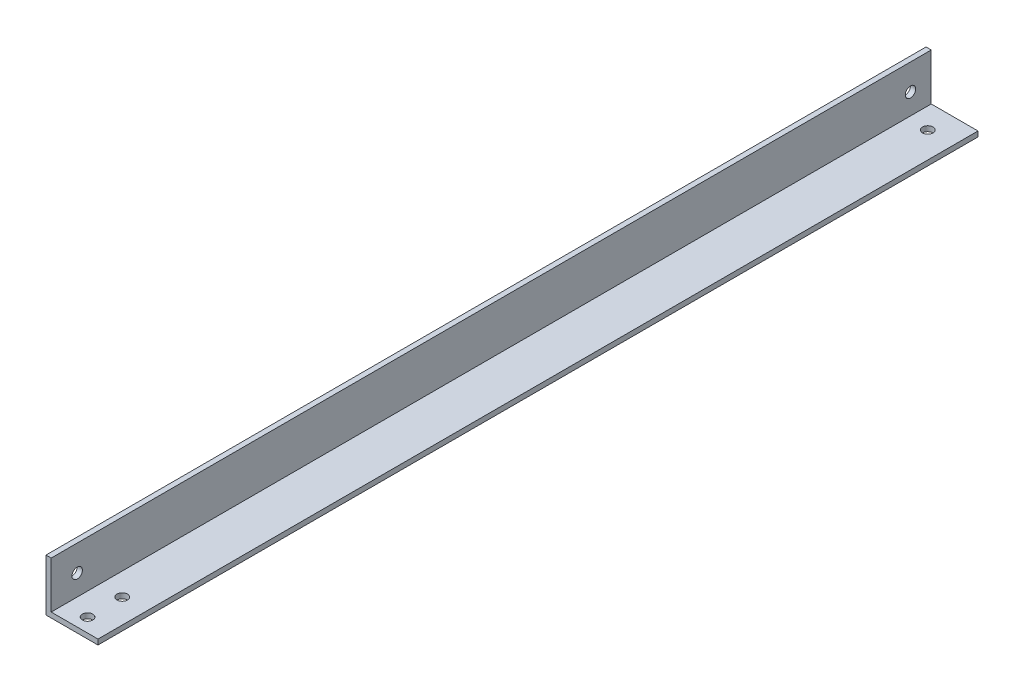
ISO-10303-21;
HEADER;
FILE_DESCRIPTION(('STEP AP214'),'2;1');
FILE_NAME('part.step','',(''),(''),'','','');
FILE_SCHEMA(('AUTOMOTIVE_DESIGN { 1 0 10303 214 1 1 1 1 }'));
ENDSEC;
DATA;
#1=APPLICATION_CONTEXT('core data for automotive mechanical design processes');
#2=APPLICATION_PROTOCOL_DEFINITION('international standard','automotive_design',2000,#1);
#3=PRODUCT_CONTEXT('',#1,'mechanical');
#4=PRODUCT('Part','Part','',(#3));
#5=PRODUCT_RELATED_PRODUCT_CATEGORY('part','',(#4));
#6=PRODUCT_DEFINITION_FORMATION('','',#4);
#7=PRODUCT_DEFINITION_CONTEXT('part definition',#1,'design');
#8=PRODUCT_DEFINITION('design','',#6,#7);
#9=PRODUCT_DEFINITION_SHAPE('','',#8);
#10=(LENGTH_UNIT() NAMED_UNIT(*) SI_UNIT(.MILLI.,.METRE.));
#11=(NAMED_UNIT(*) PLANE_ANGLE_UNIT() SI_UNIT($,.RADIAN.));
#12=(NAMED_UNIT(*) SI_UNIT($,.STERADIAN.) SOLID_ANGLE_UNIT());
#13=UNCERTAINTY_MEASURE_WITH_UNIT(LENGTH_MEASURE(1.E-05),#10,'distance_accuracy_value','');
#14=(GEOMETRIC_REPRESENTATION_CONTEXT(3) GLOBAL_UNCERTAINTY_ASSIGNED_CONTEXT((#13)) GLOBAL_UNIT_ASSIGNED_CONTEXT((#10,
#11,#12)) REPRESENTATION_CONTEXT('',''));
#15=CARTESIAN_POINT('',(0.,0.,0.));
#16=DIRECTION('',(0.,0.,1.));
#17=DIRECTION('',(1.,0.,0.));
#18=AXIS2_PLACEMENT_3D('',#15,#16,#17);
#19=CARTESIAN_POINT('',(-19.7353966243928,-5.62738853503184,254.));
#20=DIRECTION('',(0.,-1.,0.));
#21=DIRECTION('',(0.,0.,-1.));
#22=AXIS2_PLACEMENT_3D('',#19,#20,#21);
#23=PLANE('',#22);
#24=DIRECTION('',(-1.,0.,0.));
#25=VECTOR('',#24,1.);
#26=CARTESIAN_POINT('',(-19.7353966243928,-5.62738853503184,0.));
#27=LINE('',#26,#25);
#28=CARTESIAN_POINT('',(-19.7353966243928,-5.62738853503184,0.));
#29=VERTEX_POINT('',#28);
#30=CARTESIAN_POINT('',(-21.2353966243928,-5.62738853503184,0.));
#31=VERTEX_POINT('',#30);
#32=EDGE_CURVE('E115',#29,#31,#27,.T.);
#33=ORIENTED_EDGE('',*,*,#32,.T.);
#34=DIRECTION('',(0.,0.,-1.));
#35=VECTOR('',#34,1.);
#36=CARTESIAN_POINT('',(-21.2353966243928,-5.62738853503184,254.));
#37=LINE('',#36,#35);
#38=CARTESIAN_POINT('',(-21.2353966243928,-5.62738853503184,254.));
#39=VERTEX_POINT('',#38);
#40=EDGE_CURVE('E11',#39,#31,#37,.T.);
#41=ORIENTED_EDGE('',*,*,#40,.F.);
#42=DIRECTION('',(-1.,0.,0.));
#43=VECTOR('',#42,1.);
#44=CARTESIAN_POINT('',(-19.7353966243928,-5.62738853503184,254.));
#45=LINE('',#44,#43);
#46=CARTESIAN_POINT('',(-19.7353966243928,-5.62738853503184,254.));
#47=VERTEX_POINT('',#46);
#48=EDGE_CURVE('E126',#47,#39,#45,.T.);
#49=ORIENTED_EDGE('',*,*,#48,.F.);
#50=DIRECTION('',(0.,0.,-1.));
#51=VECTOR('',#50,1.);
#52=CARTESIAN_POINT('',(-19.7353966243928,-5.62738853503184,254.));
#53=LINE('',#52,#51);
#54=EDGE_CURVE('E111',#47,#29,#53,.T.);
#55=ORIENTED_EDGE('',*,*,#54,.T.);
#56=EDGE_LOOP('',(#33,#41,#49,#55));
#57=FACE_BOUND('',#56,.T.);
#58=ADVANCED_FACE('F31',(#57),#23,.F.);
#59=CARTESIAN_POINT('',(-21.2353966243928,-5.62738853503184,254.));
#60=DIRECTION('',(1.,0.,0.));
#61=DIRECTION('',(0.,1.,0.));
#62=AXIS2_PLACEMENT_3D('',#59,#60,#61);
#63=PLANE('',#62);
#64=CARTESIAN_POINT('',(-21.2353966243928,-13.1273885350318,246.5));
#65=DIRECTION('',(1.,0.,0.));
#66=DIRECTION('',(0.,1.,0.));
#67=AXIS2_PLACEMENT_3D('',#64,#65,#66);
#68=CIRCLE('',#67,1.5);
#69=CARTESIAN_POINT('',(-21.2353966243929,-13.1273885350318,245.));
#70=VERTEX_POINT('',#69);
#71=EDGE_CURVE('E258',#70,#70,#68,.T.);
#72=ORIENTED_EDGE('',*,*,#71,.T.);
#73=EDGE_LOOP('',(#72));
#74=FACE_BOUND('',#73,.T.);
#75=CARTESIAN_POINT('',(-21.2353966243928,-13.1273885350318,6.));
#76=DIRECTION('',(1.,0.,0.));
#77=DIRECTION('',(0.,1.,0.));
#78=AXIS2_PLACEMENT_3D('',#75,#76,#77);
#79=CIRCLE('',#78,1.5);
#80=CARTESIAN_POINT('',(-21.2353966243929,-13.1273885350318,4.5));
#81=VERTEX_POINT('',#80);
#82=EDGE_CURVE('E262',#81,#81,#79,.T.);
#83=ORIENTED_EDGE('',*,*,#82,.T.);
#84=EDGE_LOOP('',(#83));
#85=FACE_BOUND('',#84,.T.);
#86=DIRECTION('',(0.,-1.,0.));
#87=VECTOR('',#86,1.);
#88=CARTESIAN_POINT('',(-21.2353966243928,-5.62738853503184,0.));
#89=LINE('',#88,#87);
#90=CARTESIAN_POINT('',(-21.2353966243928,-20.6273885350318,0.));
#91=VERTEX_POINT('',#90);
#92=EDGE_CURVE('E118',#31,#91,#89,.T.);
#93=ORIENTED_EDGE('',*,*,#92,.T.);
#94=DIRECTION('',(0.,0.,-1.));
#95=VECTOR('',#94,1.);
#96=CARTESIAN_POINT('',(-21.2353966243928,-20.6273885350318,254.));
#97=LINE('',#96,#95);
#98=CARTESIAN_POINT('',(-21.2353966243928,-20.6273885350318,254.));
#99=VERTEX_POINT('',#98);
#100=EDGE_CURVE('E39',#99,#91,#97,.T.);
#101=ORIENTED_EDGE('',*,*,#100,.F.);
#102=DIRECTION('',(0.,-1.,0.));
#103=VECTOR('',#102,1.);
#104=CARTESIAN_POINT('',(-21.2353966243928,-5.62738853503184,254.));
#105=LINE('',#104,#103);
#106=EDGE_CURVE('E84',#39,#99,#105,.T.);
#107=ORIENTED_EDGE('',*,*,#106,.F.);
#108=ORIENTED_EDGE('',*,*,#40,.T.);
#109=EDGE_LOOP('',(#93,#101,#107,#108));
#110=FACE_BOUND('',#109,.T.);
#111=ADVANCED_FACE('F154',(#74,#85,#110),#63,.F.);
#112=CARTESIAN_POINT('',(-21.2353966243928,-20.6273885350318,254.));
#113=DIRECTION('',(0.,1.,0.));
#114=DIRECTION('',(0.,0.,1.));
#115=AXIS2_PLACEMENT_3D('',#112,#113,#114);
#116=PLANE('',#115);
#117=CARTESIAN_POINT('',(-13.2353966243928,-20.6273885350318,240.));
#118=DIRECTION('',(0.,1.,0.));
#119=DIRECTION('',(0.,0.,1.));
#120=AXIS2_PLACEMENT_3D('',#117,#118,#119);
#121=CIRCLE('',#120,1.5);
#122=CARTESIAN_POINT('',(-13.2353966243928,-20.6273885350318,241.5));
#123=VERTEX_POINT('',#122);
#124=EDGE_CURVE('E271',#123,#123,#121,.T.);
#125=ORIENTED_EDGE('',*,*,#124,.T.);
#126=EDGE_LOOP('',(#125));
#127=FACE_BOUND('',#126,.T.);
#128=CARTESIAN_POINT('',(-13.2353966243928,-20.6273885350318,250.));
#129=DIRECTION('',(0.,1.,0.));
#130=DIRECTION('',(0.,0.,1.));
#131=AXIS2_PLACEMENT_3D('',#128,#129,#130);
#132=CIRCLE('',#131,1.5);
#133=CARTESIAN_POINT('',(-13.2353966243928,-20.6273885350318,251.5));
#134=VERTEX_POINT('',#133);
#135=EDGE_CURVE('E277',#134,#134,#132,.T.);
#136=ORIENTED_EDGE('',*,*,#135,.T.);
#137=EDGE_LOOP('',(#136));
#138=FACE_BOUND('',#137,.T.);
#139=CARTESIAN_POINT('',(-13.7353966243928,-20.6273885350318,7.00000000000001));
#140=DIRECTION('',(0.,1.,0.));
#141=DIRECTION('',(0.,0.,1.));
#142=AXIS2_PLACEMENT_3D('',#139,#140,#141);
#143=CIRCLE('',#142,1.5);
#144=CARTESIAN_POINT('',(-13.7353966243928,-20.6273885350318,8.50000000000001));
#145=VERTEX_POINT('',#144);
#146=EDGE_CURVE('E119',#145,#145,#143,.T.);
#147=ORIENTED_EDGE('',*,*,#146,.T.);
#148=EDGE_LOOP('',(#147));
#149=FACE_BOUND('',#148,.T.);
#150=DIRECTION('',(1.,0.,0.));
#151=VECTOR('',#150,1.);
#152=CARTESIAN_POINT('',(-21.2353966243928,-20.6273885350318,0.));
#153=LINE('',#152,#151);
#154=CARTESIAN_POINT('',(-6.23539662439283,-20.6273885350318,0.));
#155=VERTEX_POINT('',#154);
#156=EDGE_CURVE('E121',#91,#155,#153,.T.);
#157=ORIENTED_EDGE('',*,*,#156,.T.);
#158=DIRECTION('',(0.,0.,-1.));
#159=VECTOR('',#158,1.);
#160=CARTESIAN_POINT('',(-6.23539662439283,-20.6273885350318,254.));
#161=LINE('',#160,#159);
#162=CARTESIAN_POINT('',(-6.23539662439283,-20.6273885350318,254.));
#163=VERTEX_POINT('',#162);
#164=EDGE_CURVE('E106',#163,#155,#161,.T.);
#165=ORIENTED_EDGE('',*,*,#164,.F.);
#166=DIRECTION('',(1.,0.,0.));
#167=VECTOR('',#166,1.);
#168=CARTESIAN_POINT('',(-21.2353966243928,-20.6273885350318,254.));
#169=LINE('',#168,#167);
#170=EDGE_CURVE('E97',#99,#163,#169,.T.);
#171=ORIENTED_EDGE('',*,*,#170,.F.);
#172=ORIENTED_EDGE('',*,*,#100,.T.);
#173=EDGE_LOOP('',(#157,#165,#171,#172));
#174=FACE_BOUND('',#173,.T.);
#175=ADVANCED_FACE('F132',(#127,#138,#149,#174),#116,.F.);
#176=CARTESIAN_POINT('',(-6.23539662439283,-20.6273885350318,254.));
#177=DIRECTION('',(-1.,0.,0.));
#178=DIRECTION('',(0.,0.,1.));
#179=AXIS2_PLACEMENT_3D('',#176,#177,#178);
#180=PLANE('',#179);
#181=DIRECTION('',(0.,1.,0.));
#182=VECTOR('',#181,1.);
#183=CARTESIAN_POINT('',(-6.23539662439283,-20.6273885350318,0.));
#184=LINE('',#183,#182);
#185=CARTESIAN_POINT('',(-6.23539662439283,-19.1273885350318,0.));
#186=VERTEX_POINT('',#185);
#187=EDGE_CURVE('E105',#155,#186,#184,.T.);
#188=ORIENTED_EDGE('',*,*,#187,.T.);
#189=DIRECTION('',(0.,0.,-1.));
#190=VECTOR('',#189,1.);
#191=CARTESIAN_POINT('',(-6.23539662439283,-19.1273885350318,254.));
#192=LINE('',#191,#190);
#193=CARTESIAN_POINT('',(-6.23539662439283,-19.1273885350318,254.));
#194=VERTEX_POINT('',#193);
#195=EDGE_CURVE('E102',#194,#186,#192,.T.);
#196=ORIENTED_EDGE('',*,*,#195,.F.);
#197=DIRECTION('',(0.,1.,0.));
#198=VECTOR('',#197,1.);
#199=CARTESIAN_POINT('',(-6.23539662439283,-20.6273885350318,254.));
#200=LINE('',#199,#198);
#201=EDGE_CURVE('E91',#163,#194,#200,.T.);
#202=ORIENTED_EDGE('',*,*,#201,.F.);
#203=ORIENTED_EDGE('',*,*,#164,.T.);
#204=EDGE_LOOP('',(#188,#196,#202,#203));
#205=FACE_BOUND('',#204,.T.);
#206=ADVANCED_FACE('F103',(#205),#180,.F.);
#207=CARTESIAN_POINT('',(-6.23539662439283,-19.1273885350318,254.));
#208=DIRECTION('',(0.,-1.,0.));
#209=DIRECTION('',(0.,0.,-1.));
#210=AXIS2_PLACEMENT_3D('',#207,#208,#209);
#211=PLANE('',#210);
#212=CARTESIAN_POINT('',(-13.2353966243928,-19.1273885350318,240.));
#213=DIRECTION('',(0.,1.,0.));
#214=DIRECTION('',(0.,0.,1.));
#215=AXIS2_PLACEMENT_3D('',#212,#213,#214);
#216=CIRCLE('',#215,1.5);
#217=CARTESIAN_POINT('',(-13.2353966243928,-19.1273885350318,241.5));
#218=VERTEX_POINT('',#217);
#219=EDGE_CURVE('E268',#218,#218,#216,.T.);
#220=ORIENTED_EDGE('',*,*,#219,.F.);
#221=EDGE_LOOP('',(#220));
#222=FACE_BOUND('',#221,.T.);
#223=CARTESIAN_POINT('',(-13.2353966243928,-19.1273885350318,250.));
#224=DIRECTION('',(0.,1.,0.));
#225=DIRECTION('',(0.,0.,1.));
#226=AXIS2_PLACEMENT_3D('',#223,#224,#225);
#227=CIRCLE('',#226,1.5);
#228=CARTESIAN_POINT('',(-13.2353966243928,-19.1273885350318,251.5));
#229=VERTEX_POINT('',#228);
#230=EDGE_CURVE('E274',#229,#229,#227,.T.);
#231=ORIENTED_EDGE('',*,*,#230,.F.);
#232=EDGE_LOOP('',(#231));
#233=FACE_BOUND('',#232,.T.);
#234=CARTESIAN_POINT('',(-13.7353966243928,-19.1273885350318,7.00000000000001));
#235=DIRECTION('',(0.,1.,0.));
#236=DIRECTION('',(0.,0.,1.));
#237=AXIS2_PLACEMENT_3D('',#234,#235,#236);
#238=CIRCLE('',#237,1.5);
#239=CARTESIAN_POINT('',(-13.7353966243928,-19.1273885350318,8.50000000000001));
#240=VERTEX_POINT('',#239);
#241=EDGE_CURVE('E280',#240,#240,#238,.T.);
#242=ORIENTED_EDGE('',*,*,#241,.F.);
#243=EDGE_LOOP('',(#242));
#244=FACE_BOUND('',#243,.T.);
#245=DIRECTION('',(-1.,0.,0.));
#246=VECTOR('',#245,1.);
#247=CARTESIAN_POINT('',(-6.23539662439283,-19.1273885350318,0.));
#248=LINE('',#247,#246);
#249=CARTESIAN_POINT('',(-19.7353966243928,-19.1273885350318,0.));
#250=VERTEX_POINT('',#249);
#251=EDGE_CURVE('E70',#186,#250,#248,.T.);
#252=ORIENTED_EDGE('',*,*,#251,.T.);
#253=DIRECTION('',(0.,0.,-1.));
#254=VECTOR('',#253,1.);
#255=CARTESIAN_POINT('',(-19.7353966243928,-19.1273885350318,254.));
#256=LINE('',#255,#254);
#257=CARTESIAN_POINT('',(-19.7353966243928,-19.1273885350318,254.));
#258=VERTEX_POINT('',#257);
#259=EDGE_CURVE('E107',#258,#250,#256,.T.);
#260=ORIENTED_EDGE('',*,*,#259,.F.);
#261=DIRECTION('',(-1.,0.,0.));
#262=VECTOR('',#261,1.);
#263=CARTESIAN_POINT('',(-6.23539662439283,-19.1273885350318,254.));
#264=LINE('',#263,#262);
#265=EDGE_CURVE('E95',#194,#258,#264,.T.);
#266=ORIENTED_EDGE('',*,*,#265,.F.);
#267=ORIENTED_EDGE('',*,*,#195,.T.);
#268=EDGE_LOOP('',(#252,#260,#266,#267));
#269=FACE_BOUND('',#268,.T.);
#270=ADVANCED_FACE('F109',(#222,#233,#244,#269),#211,.F.);
#271=CARTESIAN_POINT('',(-19.7353966243928,-19.1273885350318,254.));
#272=DIRECTION('',(-1.,0.,0.));
#273=DIRECTION('',(0.,0.,1.));
#274=AXIS2_PLACEMENT_3D('',#271,#272,#273);
#275=PLANE('',#274);
#276=CARTESIAN_POINT('',(-19.7353966243928,-13.1273885350318,246.5));
#277=DIRECTION('',(1.,0.,0.));
#278=DIRECTION('',(0.,0.,-1.));
#279=AXIS2_PLACEMENT_3D('',#276,#277,#278);
#280=CIRCLE('',#279,1.5);
#281=CARTESIAN_POINT('',(-19.7353966243929,-13.1273885350318,245.));
#282=VERTEX_POINT('',#281);
#283=EDGE_CURVE('E256',#282,#282,#280,.T.);
#284=ORIENTED_EDGE('',*,*,#283,.F.);
#285=EDGE_LOOP('',(#284));
#286=FACE_BOUND('',#285,.T.);
#287=CARTESIAN_POINT('',(-19.7353966243928,-13.1273885350318,6.));
#288=DIRECTION('',(1.,0.,0.));
#289=DIRECTION('',(0.,0.,-1.));
#290=AXIS2_PLACEMENT_3D('',#287,#288,#289);
#291=CIRCLE('',#290,1.5);
#292=CARTESIAN_POINT('',(-19.7353966243929,-13.1273885350318,4.5));
#293=VERTEX_POINT('',#292);
#294=EDGE_CURVE('E259',#293,#293,#291,.T.);
#295=ORIENTED_EDGE('',*,*,#294,.F.);
#296=EDGE_LOOP('',(#295));
#297=FACE_BOUND('',#296,.T.);
#298=DIRECTION('',(0.,1.,0.));
#299=VECTOR('',#298,1.);
#300=CARTESIAN_POINT('',(-19.7353966243928,-19.1273885350318,0.));
#301=LINE('',#300,#299);
#302=EDGE_CURVE('E76',#250,#29,#301,.T.);
#303=ORIENTED_EDGE('',*,*,#302,.T.);
#304=ORIENTED_EDGE('',*,*,#54,.F.);
#305=DIRECTION('',(0.,1.,0.));
#306=VECTOR('',#305,1.);
#307=CARTESIAN_POINT('',(-19.7353966243928,-19.1273885350318,254.));
#308=LINE('',#307,#306);
#309=EDGE_CURVE('E47',#258,#47,#308,.T.);
#310=ORIENTED_EDGE('',*,*,#309,.F.);
#311=ORIENTED_EDGE('',*,*,#259,.T.);
#312=EDGE_LOOP('',(#303,#304,#310,#311));
#313=FACE_BOUND('',#312,.T.);
#314=ADVANCED_FACE('F139',(#286,#297,#313),#275,.F.);
#315=CARTESIAN_POINT('',(-21.2353966243928,-5.62738853503184,254.));
#316=DIRECTION('',(0.,0.,1.));
#317=DIRECTION('',(1.,0.,0.));
#318=AXIS2_PLACEMENT_3D('',#315,#316,#317);
#319=PLANE('',#318);
#320=ORIENTED_EDGE('',*,*,#48,.T.);
#321=ORIENTED_EDGE('',*,*,#106,.T.);
#322=ORIENTED_EDGE('',*,*,#170,.T.);
#323=ORIENTED_EDGE('',*,*,#201,.T.);
#324=ORIENTED_EDGE('',*,*,#265,.T.);
#325=ORIENTED_EDGE('',*,*,#309,.T.);
#326=EDGE_LOOP('',(#320,#321,#322,#323,#324,#325));
#327=FACE_BOUND('',#326,.T.);
#328=ADVANCED_FACE('F93',(#327),#319,.T.);
#329=CARTESIAN_POINT('',(-21.2353966243928,-5.62738853503184,0.));
#330=DIRECTION('',(0.,0.,1.));
#331=DIRECTION('',(1.,0.,0.));
#332=AXIS2_PLACEMENT_3D('',#329,#330,#331);
#333=PLANE('',#332);
#334=ORIENTED_EDGE('',*,*,#32,.F.);
#335=ORIENTED_EDGE('',*,*,#302,.F.);
#336=ORIENTED_EDGE('',*,*,#251,.F.);
#337=ORIENTED_EDGE('',*,*,#187,.F.);
#338=ORIENTED_EDGE('',*,*,#156,.F.);
#339=ORIENTED_EDGE('',*,*,#92,.F.);
#340=EDGE_LOOP('',(#334,#335,#336,#337,#338,#339));
#341=FACE_BOUND('',#340,.T.);
#342=ADVANCED_FACE('F135',(#341),#333,.F.);
#343=CARTESIAN_POINT('',(-13.7353966243928,-205.127388535032,7.00000000000001));
#344=DIRECTION('',(0.,1.,0.));
#345=DIRECTION('',(0.,0.,1.));
#346=AXIS2_PLACEMENT_3D('',#343,#344,#345);
#347=CYLINDRICAL_SURFACE('',#346,1.5);
#348=CARTESIAN_POINT('',(-13.7353966243928,-19.1273885350318,8.50000000000001));
#349=CARTESIAN_POINT('',(-13.7353966243928,-19.1430135350318,8.50000000000001));
#350=CARTESIAN_POINT('',(-13.7353966243928,-19.1586385350318,8.50000000000001));
#351=CARTESIAN_POINT('',(-13.7353966243928,-19.1898885350319,8.50000000000001));
#352=CARTESIAN_POINT('',(-13.7353966243928,-19.2055135350318,8.50000000000001));
#353=CARTESIAN_POINT('',(-13.7353966243928,-19.2367635350319,8.50000000000001));
#354=CARTESIAN_POINT('',(-13.7353966243928,-19.2523885350319,8.50000000000001));
#355=CARTESIAN_POINT('',(-13.7353966243928,-19.2836385350319,8.50000000000001));
#356=CARTESIAN_POINT('',(-13.7353966243928,-19.2992635350319,8.50000000000001));
#357=CARTESIAN_POINT('',(-13.7353966243928,-19.3305135350319,8.50000000000001));
#358=CARTESIAN_POINT('',(-13.7353966243928,-19.3461385350319,8.50000000000001));
#359=CARTESIAN_POINT('',(-13.7353966243928,-19.3773885350319,8.50000000000001));
#360=CARTESIAN_POINT('',(-13.7353966243928,-19.3930135350319,8.50000000000001));
#361=CARTESIAN_POINT('',(-13.7353966243928,-19.4242635350319,8.50000000000001));
#362=CARTESIAN_POINT('',(-13.7353966243928,-19.4398885350319,8.50000000000001));
#363=CARTESIAN_POINT('',(-13.7353966243928,-19.4711385350319,8.50000000000001));
#364=CARTESIAN_POINT('',(-13.7353966243928,-19.4867635350319,8.50000000000001));
#365=CARTESIAN_POINT('',(-13.7353966243928,-19.5180135350319,8.50000000000001));
#366=CARTESIAN_POINT('',(-13.7353966243928,-19.5336385350318,8.50000000000001));
#367=CARTESIAN_POINT('',(-13.7353966243928,-19.5648885350318,8.50000000000001));
#368=CARTESIAN_POINT('',(-13.7353966243928,-19.5805135350318,8.50000000000001));
#369=CARTESIAN_POINT('',(-13.7353966243928,-19.6117635350318,8.50000000000001));
#370=CARTESIAN_POINT('',(-13.7353966243928,-19.6273885350318,8.50000000000001));
#371=CARTESIAN_POINT('',(-13.7353966243928,-19.6586385350318,8.50000000000001));
#372=CARTESIAN_POINT('',(-13.7353966243928,-19.6742635350318,8.50000000000001));
#373=CARTESIAN_POINT('',(-13.7353966243928,-19.7055135350318,8.50000000000001));
#374=CARTESIAN_POINT('',(-13.7353966243928,-19.7211385350318,8.50000000000001));
#375=CARTESIAN_POINT('',(-13.7353966243928,-19.7523885350318,8.50000000000001));
#376=CARTESIAN_POINT('',(-13.7353966243928,-19.7680135350318,8.50000000000001));
#377=CARTESIAN_POINT('',(-13.7353966243928,-19.7992635350318,8.50000000000001));
#378=CARTESIAN_POINT('',(-13.7353966243928,-19.8148885350318,8.50000000000001));
#379=CARTESIAN_POINT('',(-13.7353966243928,-19.8461385350318,8.50000000000001));
#380=CARTESIAN_POINT('',(-13.7353966243928,-19.8617635350318,8.50000000000001));
#381=CARTESIAN_POINT('',(-13.7353966243928,-19.8930135350318,8.50000000000001));
#382=CARTESIAN_POINT('',(-13.7353966243928,-19.9086385350318,8.50000000000001));
#383=CARTESIAN_POINT('',(-13.7353966243928,-19.9398885350319,8.50000000000001));
#384=CARTESIAN_POINT('',(-13.7353966243928,-19.9555135350319,8.50000000000001));
#385=CARTESIAN_POINT('',(-13.7353966243928,-19.9867635350319,8.50000000000001));
#386=CARTESIAN_POINT('',(-13.7353966243928,-20.0023885350319,8.50000000000001));
#387=CARTESIAN_POINT('',(-13.7353966243928,-20.0336385350319,8.50000000000001));
#388=CARTESIAN_POINT('',(-13.7353966243928,-20.0492635350319,8.50000000000001));
#389=CARTESIAN_POINT('',(-13.7353966243928,-20.0805135350319,8.50000000000001));
#390=CARTESIAN_POINT('',(-13.7353966243928,-20.0961385350319,8.50000000000001));
#391=CARTESIAN_POINT('',(-13.7353966243928,-20.1273885350319,8.50000000000001));
#392=CARTESIAN_POINT('',(-13.7353966243928,-20.1430135350319,8.50000000000001));
#393=CARTESIAN_POINT('',(-13.7353966243928,-20.1742635350319,8.50000000000001));
#394=CARTESIAN_POINT('',(-13.7353966243928,-20.1898885350319,8.50000000000001));
#395=CARTESIAN_POINT('',(-13.7353966243928,-20.2211385350319,8.50000000000001));
#396=CARTESIAN_POINT('',(-13.7353966243928,-20.2367635350318,8.50000000000001));
#397=CARTESIAN_POINT('',(-13.7353966243928,-20.2680135350318,8.50000000000001));
#398=CARTESIAN_POINT('',(-13.7353966243928,-20.2836385350318,8.50000000000001));
#399=CARTESIAN_POINT('',(-13.7353966243928,-20.3148885350318,8.50000000000001));
#400=CARTESIAN_POINT('',(-13.7353966243928,-20.3305135350318,8.50000000000001));
#401=CARTESIAN_POINT('',(-13.7353966243928,-20.3617635350318,8.50000000000001));
#402=CARTESIAN_POINT('',(-13.7353966243928,-20.3773885350318,8.50000000000001));
#403=CARTESIAN_POINT('',(-13.7353966243928,-20.4086385350318,8.50000000000001));
#404=CARTESIAN_POINT('',(-13.7353966243928,-20.4242635350318,8.50000000000001));
#405=CARTESIAN_POINT('',(-13.7353966243928,-20.4555135350318,8.50000000000001));
#406=CARTESIAN_POINT('',(-13.7353966243928,-20.4711385350318,8.50000000000001));
#407=CARTESIAN_POINT('',(-13.7353966243928,-20.5023885350318,8.50000000000001));
#408=CARTESIAN_POINT('',(-13.7353966243928,-20.5180135350318,8.50000000000001));
#409=CARTESIAN_POINT('',(-13.7353966243928,-20.5492635350318,8.50000000000001));
#410=CARTESIAN_POINT('',(-13.7353966243928,-20.5648885350318,8.50000000000001));
#411=CARTESIAN_POINT('',(-13.7353966243928,-20.5961385350318,8.50000000000001));
#412=CARTESIAN_POINT('',(-13.7353966243928,-20.6117635350318,8.50000000000001));
#413=CARTESIAN_POINT('',(-13.7353966243928,-20.6273885350318,8.50000000000001));
#414=B_SPLINE_CURVE_WITH_KNOTS('',3,(#348,#349,#350,#351,#352,#353,#354,#355,#356,#357,#358,
#359,#360,#361,#362,#363,#364,#365,#366,#367,#368,#369,#370,#371,#372,#373,#374,#375,#376,#377,
#378,#379,#380,#381,#382,#383,#384,#385,#386,#387,#388,#389,#390,#391,#392,#393,#394,#395,#396,
#397,#398,#399,#400,#401,#402,#403,#404,#405,#406,#407,#408,#409,#410,#411,#412,#413),
.UNSPECIFIED.,.F.,.F.,(4,2,2,2,2,2,2,2,2,2,2,2,2,2,2,2,2,2,2,2,2,2,2,2,2,2,2,2,2,2,2,2,4),(0.,
0.0468750000000018,0.0937500000000036,0.140625000000005,0.187500000000007,0.234375000000009,
0.281250000000011,0.328125000000012,0.375000000000014,0.421874999999988,0.46874999999999,
0.515624999999992,0.562499999999994,0.609374999999995,0.656249999999997,0.703124999999999,
0.750000000000001,0.796875000000002,0.843750000000004,0.890625000000006,0.937500000000008,
0.98437500000001,1.03125000000001,1.07812500000001,1.12499999999999,1.17187499999999,
1.21874999999999,1.26562499999999,1.31249999999999,1.359375,1.40625,1.453125,1.5),.UNSPECIFIED.);
#415=EDGE_CURVE('BSEAM186',#240,#145,#414,.T.);
#416=ORIENTED_EDGE('',*,*,#241,.T.);
#417=ORIENTED_EDGE('',*,*,#146,.F.);
#418=ORIENTED_EDGE('',*,*,#415,.T.);
#419=ORIENTED_EDGE('',*,*,#415,.F.);
#420=EDGE_LOOP('',(#416,#418,#417,#419));
#421=FACE_BOUND('',#420,.T.);
#422=ADVANCED_FACE('F186',(#421),#347,.F.);
#423=CARTESIAN_POINT('',(-13.2353966243928,-205.127388535032,250.));
#424=DIRECTION('',(0.,1.,0.));
#425=DIRECTION('',(0.,0.,1.));
#426=AXIS2_PLACEMENT_3D('',#423,#424,#425);
#427=CYLINDRICAL_SURFACE('',#426,1.5);
#428=CARTESIAN_POINT('',(-13.2353966243928,-19.1273885350318,251.5));
#429=CARTESIAN_POINT('',(-13.2353966243928,-19.1430135350318,251.5));
#430=CARTESIAN_POINT('',(-13.2353966243928,-19.1586385350318,251.5));
#431=CARTESIAN_POINT('',(-13.2353966243928,-19.1898885350319,251.5));
#432=CARTESIAN_POINT('',(-13.2353966243928,-19.2055135350318,251.5));
#433=CARTESIAN_POINT('',(-13.2353966243928,-19.2367635350319,251.5));
#434=CARTESIAN_POINT('',(-13.2353966243928,-19.2523885350319,251.5));
#435=CARTESIAN_POINT('',(-13.2353966243928,-19.2836385350319,251.5));
#436=CARTESIAN_POINT('',(-13.2353966243928,-19.2992635350319,251.5));
#437=CARTESIAN_POINT('',(-13.2353966243928,-19.3305135350319,251.5));
#438=CARTESIAN_POINT('',(-13.2353966243928,-19.3461385350319,251.5));
#439=CARTESIAN_POINT('',(-13.2353966243928,-19.3773885350319,251.5));
#440=CARTESIAN_POINT('',(-13.2353966243928,-19.3930135350319,251.5));
#441=CARTESIAN_POINT('',(-13.2353966243928,-19.4242635350319,251.5));
#442=CARTESIAN_POINT('',(-13.2353966243928,-19.4398885350319,251.5));
#443=CARTESIAN_POINT('',(-13.2353966243928,-19.4711385350319,251.5));
#444=CARTESIAN_POINT('',(-13.2353966243928,-19.4867635350319,251.5));
#445=CARTESIAN_POINT('',(-13.2353966243928,-19.5180135350319,251.5));
#446=CARTESIAN_POINT('',(-13.2353966243928,-19.5336385350318,251.5));
#447=CARTESIAN_POINT('',(-13.2353966243928,-19.5648885350318,251.5));
#448=CARTESIAN_POINT('',(-13.2353966243928,-19.5805135350318,251.5));
#449=CARTESIAN_POINT('',(-13.2353966243928,-19.6117635350318,251.5));
#450=CARTESIAN_POINT('',(-13.2353966243928,-19.6273885350318,251.5));
#451=CARTESIAN_POINT('',(-13.2353966243928,-19.6586385350318,251.5));
#452=CARTESIAN_POINT('',(-13.2353966243928,-19.6742635350318,251.5));
#453=CARTESIAN_POINT('',(-13.2353966243928,-19.7055135350318,251.5));
#454=CARTESIAN_POINT('',(-13.2353966243928,-19.7211385350318,251.5));
#455=CARTESIAN_POINT('',(-13.2353966243928,-19.7523885350318,251.5));
#456=CARTESIAN_POINT('',(-13.2353966243928,-19.7680135350318,251.5));
#457=CARTESIAN_POINT('',(-13.2353966243928,-19.7992635350318,251.5));
#458=CARTESIAN_POINT('',(-13.2353966243928,-19.8148885350318,251.5));
#459=CARTESIAN_POINT('',(-13.2353966243928,-19.8461385350318,251.5));
#460=CARTESIAN_POINT('',(-13.2353966243928,-19.8617635350318,251.5));
#461=CARTESIAN_POINT('',(-13.2353966243928,-19.8930135350318,251.5));
#462=CARTESIAN_POINT('',(-13.2353966243928,-19.9086385350318,251.5));
#463=CARTESIAN_POINT('',(-13.2353966243928,-19.9398885350319,251.5));
#464=CARTESIAN_POINT('',(-13.2353966243928,-19.9555135350319,251.5));
#465=CARTESIAN_POINT('',(-13.2353966243928,-19.9867635350319,251.5));
#466=CARTESIAN_POINT('',(-13.2353966243928,-20.0023885350319,251.5));
#467=CARTESIAN_POINT('',(-13.2353966243928,-20.0336385350319,251.5));
#468=CARTESIAN_POINT('',(-13.2353966243928,-20.0492635350319,251.5));
#469=CARTESIAN_POINT('',(-13.2353966243928,-20.0805135350319,251.5));
#470=CARTESIAN_POINT('',(-13.2353966243928,-20.0961385350319,251.5));
#471=CARTESIAN_POINT('',(-13.2353966243928,-20.1273885350319,251.5));
#472=CARTESIAN_POINT('',(-13.2353966243928,-20.1430135350319,251.5));
#473=CARTESIAN_POINT('',(-13.2353966243928,-20.1742635350319,251.5));
#474=CARTESIAN_POINT('',(-13.2353966243928,-20.1898885350319,251.5));
#475=CARTESIAN_POINT('',(-13.2353966243928,-20.2211385350319,251.5));
#476=CARTESIAN_POINT('',(-13.2353966243928,-20.2367635350318,251.5));
#477=CARTESIAN_POINT('',(-13.2353966243928,-20.2680135350318,251.5));
#478=CARTESIAN_POINT('',(-13.2353966243928,-20.2836385350318,251.5));
#479=CARTESIAN_POINT('',(-13.2353966243928,-20.3148885350318,251.5));
#480=CARTESIAN_POINT('',(-13.2353966243928,-20.3305135350318,251.5));
#481=CARTESIAN_POINT('',(-13.2353966243928,-20.3617635350318,251.5));
#482=CARTESIAN_POINT('',(-13.2353966243928,-20.3773885350318,251.5));
#483=CARTESIAN_POINT('',(-13.2353966243928,-20.4086385350318,251.5));
#484=CARTESIAN_POINT('',(-13.2353966243928,-20.4242635350318,251.5));
#485=CARTESIAN_POINT('',(-13.2353966243928,-20.4555135350318,251.5));
#486=CARTESIAN_POINT('',(-13.2353966243928,-20.4711385350318,251.5));
#487=CARTESIAN_POINT('',(-13.2353966243928,-20.5023885350318,251.5));
#488=CARTESIAN_POINT('',(-13.2353966243928,-20.5180135350318,251.5));
#489=CARTESIAN_POINT('',(-13.2353966243928,-20.5492635350318,251.5));
#490=CARTESIAN_POINT('',(-13.2353966243928,-20.5648885350318,251.5));
#491=CARTESIAN_POINT('',(-13.2353966243928,-20.5961385350318,251.5));
#492=CARTESIAN_POINT('',(-13.2353966243928,-20.6117635350318,251.5));
#493=CARTESIAN_POINT('',(-13.2353966243928,-20.6273885350318,251.5));
#494=B_SPLINE_CURVE_WITH_KNOTS('',3,(#428,#429,#430,#431,#432,#433,#434,#435,#436,#437,#438,
#439,#440,#441,#442,#443,#444,#445,#446,#447,#448,#449,#450,#451,#452,#453,#454,#455,#456,#457,
#458,#459,#460,#461,#462,#463,#464,#465,#466,#467,#468,#469,#470,#471,#472,#473,#474,#475,#476,
#477,#478,#479,#480,#481,#482,#483,#484,#485,#486,#487,#488,#489,#490,#491,#492,#493),
.UNSPECIFIED.,.F.,.F.,(4,2,2,2,2,2,2,2,2,2,2,2,2,2,2,2,2,2,2,2,2,2,2,2,2,2,2,2,2,2,2,2,4),(0.,
0.0468750000000018,0.0937500000000036,0.140625000000005,0.187500000000007,0.234375000000009,
0.281250000000011,0.328125000000012,0.375000000000014,0.421874999999988,0.46874999999999,
0.515624999999992,0.562499999999994,0.609374999999995,0.656249999999997,0.703124999999999,
0.750000000000001,0.796875000000002,0.843750000000004,0.890625000000006,0.937500000000008,
0.98437500000001,1.03125000000001,1.07812500000001,1.12499999999999,1.17187499999999,
1.21874999999999,1.26562499999999,1.31249999999999,1.359375,1.40625,1.453125,1.5),.UNSPECIFIED.);
#495=EDGE_CURVE('BSEAM191',#229,#134,#494,.T.);
#496=ORIENTED_EDGE('',*,*,#230,.T.);
#497=ORIENTED_EDGE('',*,*,#135,.F.);
#498=ORIENTED_EDGE('',*,*,#495,.T.);
#499=ORIENTED_EDGE('',*,*,#495,.F.);
#500=EDGE_LOOP('',(#496,#498,#497,#499));
#501=FACE_BOUND('',#500,.T.);
#502=ADVANCED_FACE('F191',(#501),#427,.F.);
#503=CARTESIAN_POINT('',(-13.2353966243928,-205.127388535032,240.));
#504=DIRECTION('',(0.,1.,0.));
#505=DIRECTION('',(0.,0.,1.));
#506=AXIS2_PLACEMENT_3D('',#503,#504,#505);
#507=CYLINDRICAL_SURFACE('',#506,1.5);
#508=CARTESIAN_POINT('',(-13.2353966243928,-19.1273885350318,241.5));
#509=CARTESIAN_POINT('',(-13.2353966243928,-19.1430135350318,241.5));
#510=CARTESIAN_POINT('',(-13.2353966243928,-19.1586385350318,241.5));
#511=CARTESIAN_POINT('',(-13.2353966243928,-19.1898885350319,241.5));
#512=CARTESIAN_POINT('',(-13.2353966243928,-19.2055135350318,241.5));
#513=CARTESIAN_POINT('',(-13.2353966243928,-19.2367635350319,241.5));
#514=CARTESIAN_POINT('',(-13.2353966243928,-19.2523885350319,241.5));
#515=CARTESIAN_POINT('',(-13.2353966243928,-19.2836385350319,241.5));
#516=CARTESIAN_POINT('',(-13.2353966243928,-19.2992635350319,241.5));
#517=CARTESIAN_POINT('',(-13.2353966243928,-19.3305135350319,241.5));
#518=CARTESIAN_POINT('',(-13.2353966243928,-19.3461385350319,241.5));
#519=CARTESIAN_POINT('',(-13.2353966243928,-19.3773885350319,241.5));
#520=CARTESIAN_POINT('',(-13.2353966243928,-19.3930135350319,241.5));
#521=CARTESIAN_POINT('',(-13.2353966243928,-19.4242635350319,241.5));
#522=CARTESIAN_POINT('',(-13.2353966243928,-19.4398885350319,241.5));
#523=CARTESIAN_POINT('',(-13.2353966243928,-19.4711385350319,241.5));
#524=CARTESIAN_POINT('',(-13.2353966243928,-19.4867635350319,241.5));
#525=CARTESIAN_POINT('',(-13.2353966243928,-19.5180135350319,241.5));
#526=CARTESIAN_POINT('',(-13.2353966243928,-19.5336385350318,241.5));
#527=CARTESIAN_POINT('',(-13.2353966243928,-19.5648885350318,241.5));
#528=CARTESIAN_POINT('',(-13.2353966243928,-19.5805135350318,241.5));
#529=CARTESIAN_POINT('',(-13.2353966243928,-19.6117635350318,241.5));
#530=CARTESIAN_POINT('',(-13.2353966243928,-19.6273885350318,241.5));
#531=CARTESIAN_POINT('',(-13.2353966243928,-19.6586385350318,241.5));
#532=CARTESIAN_POINT('',(-13.2353966243928,-19.6742635350318,241.5));
#533=CARTESIAN_POINT('',(-13.2353966243928,-19.7055135350318,241.5));
#534=CARTESIAN_POINT('',(-13.2353966243928,-19.7211385350318,241.5));
#535=CARTESIAN_POINT('',(-13.2353966243928,-19.7523885350318,241.5));
#536=CARTESIAN_POINT('',(-13.2353966243928,-19.7680135350318,241.5));
#537=CARTESIAN_POINT('',(-13.2353966243928,-19.7992635350318,241.5));
#538=CARTESIAN_POINT('',(-13.2353966243928,-19.8148885350318,241.5));
#539=CARTESIAN_POINT('',(-13.2353966243928,-19.8461385350318,241.5));
#540=CARTESIAN_POINT('',(-13.2353966243928,-19.8617635350318,241.5));
#541=CARTESIAN_POINT('',(-13.2353966243928,-19.8930135350318,241.5));
#542=CARTESIAN_POINT('',(-13.2353966243928,-19.9086385350318,241.5));
#543=CARTESIAN_POINT('',(-13.2353966243928,-19.9398885350319,241.5));
#544=CARTESIAN_POINT('',(-13.2353966243928,-19.9555135350319,241.5));
#545=CARTESIAN_POINT('',(-13.2353966243928,-19.9867635350319,241.5));
#546=CARTESIAN_POINT('',(-13.2353966243928,-20.0023885350319,241.5));
#547=CARTESIAN_POINT('',(-13.2353966243928,-20.0336385350319,241.5));
#548=CARTESIAN_POINT('',(-13.2353966243928,-20.0492635350319,241.5));
#549=CARTESIAN_POINT('',(-13.2353966243928,-20.0805135350319,241.5));
#550=CARTESIAN_POINT('',(-13.2353966243928,-20.0961385350319,241.5));
#551=CARTESIAN_POINT('',(-13.2353966243928,-20.1273885350319,241.5));
#552=CARTESIAN_POINT('',(-13.2353966243928,-20.1430135350319,241.5));
#553=CARTESIAN_POINT('',(-13.2353966243928,-20.1742635350319,241.5));
#554=CARTESIAN_POINT('',(-13.2353966243928,-20.1898885350319,241.5));
#555=CARTESIAN_POINT('',(-13.2353966243928,-20.2211385350319,241.5));
#556=CARTESIAN_POINT('',(-13.2353966243928,-20.2367635350318,241.5));
#557=CARTESIAN_POINT('',(-13.2353966243928,-20.2680135350318,241.5));
#558=CARTESIAN_POINT('',(-13.2353966243928,-20.2836385350318,241.5));
#559=CARTESIAN_POINT('',(-13.2353966243928,-20.3148885350318,241.5));
#560=CARTESIAN_POINT('',(-13.2353966243928,-20.3305135350318,241.5));
#561=CARTESIAN_POINT('',(-13.2353966243928,-20.3617635350318,241.5));
#562=CARTESIAN_POINT('',(-13.2353966243928,-20.3773885350318,241.5));
#563=CARTESIAN_POINT('',(-13.2353966243928,-20.4086385350318,241.5));
#564=CARTESIAN_POINT('',(-13.2353966243928,-20.4242635350318,241.5));
#565=CARTESIAN_POINT('',(-13.2353966243928,-20.4555135350318,241.5));
#566=CARTESIAN_POINT('',(-13.2353966243928,-20.4711385350318,241.5));
#567=CARTESIAN_POINT('',(-13.2353966243928,-20.5023885350318,241.5));
#568=CARTESIAN_POINT('',(-13.2353966243928,-20.5180135350318,241.5));
#569=CARTESIAN_POINT('',(-13.2353966243928,-20.5492635350318,241.5));
#570=CARTESIAN_POINT('',(-13.2353966243928,-20.5648885350318,241.5));
#571=CARTESIAN_POINT('',(-13.2353966243928,-20.5961385350318,241.5));
#572=CARTESIAN_POINT('',(-13.2353966243928,-20.6117635350318,241.5));
#573=CARTESIAN_POINT('',(-13.2353966243928,-20.6273885350318,241.5));
#574=B_SPLINE_CURVE_WITH_KNOTS('',3,(#508,#509,#510,#511,#512,#513,#514,#515,#516,#517,#518,
#519,#520,#521,#522,#523,#524,#525,#526,#527,#528,#529,#530,#531,#532,#533,#534,#535,#536,#537,
#538,#539,#540,#541,#542,#543,#544,#545,#546,#547,#548,#549,#550,#551,#552,#553,#554,#555,#556,
#557,#558,#559,#560,#561,#562,#563,#564,#565,#566,#567,#568,#569,#570,#571,#572,#573),
.UNSPECIFIED.,.F.,.F.,(4,2,2,2,2,2,2,2,2,2,2,2,2,2,2,2,2,2,2,2,2,2,2,2,2,2,2,2,2,2,2,2,4),(0.,
0.0468750000000018,0.0937500000000036,0.140625000000005,0.187500000000007,0.234375000000009,
0.281250000000011,0.328125000000012,0.375000000000014,0.421874999999988,0.46874999999999,
0.515624999999992,0.562499999999994,0.609374999999995,0.656249999999997,0.703124999999999,
0.750000000000001,0.796875000000002,0.843750000000004,0.890625000000006,0.937500000000008,
0.98437500000001,1.03125000000001,1.07812500000001,1.12499999999999,1.17187499999999,
1.21874999999999,1.26562499999999,1.31249999999999,1.359375,1.40625,1.453125,1.5),.UNSPECIFIED.);
#575=EDGE_CURVE('BSEAM203',#218,#123,#574,.T.);
#576=ORIENTED_EDGE('',*,*,#219,.T.);
#577=ORIENTED_EDGE('',*,*,#124,.F.);
#578=ORIENTED_EDGE('',*,*,#575,.T.);
#579=ORIENTED_EDGE('',*,*,#575,.F.);
#580=EDGE_LOOP('',(#576,#578,#577,#579));
#581=FACE_BOUND('',#580,.T.);
#582=ADVANCED_FACE('F203',(#581),#507,.F.);
#583=CARTESIAN_POINT('',(-205.735396624393,-13.1273885350318,6.));
#584=DIRECTION('',(1.,0.,0.));
#585=DIRECTION('',(0.,0.,-1.));
#586=AXIS2_PLACEMENT_3D('',#583,#584,#585);
#587=CYLINDRICAL_SURFACE('',#586,1.5);
#588=CARTESIAN_POINT('',(-19.7353966243929,-13.1273885350318,4.5));
#589=CARTESIAN_POINT('',(-19.7510216243929,-13.1273885350318,4.5));
#590=CARTESIAN_POINT('',(-19.7666466243929,-13.1273885350318,4.5));
#591=CARTESIAN_POINT('',(-19.7978966243929,-13.1273885350318,4.5));
#592=CARTESIAN_POINT('',(-19.8135216243929,-13.1273885350318,4.5));
#593=CARTESIAN_POINT('',(-19.8447716243929,-13.1273885350318,4.5));
#594=CARTESIAN_POINT('',(-19.8603966243929,-13.1273885350318,4.5));
#595=CARTESIAN_POINT('',(-19.8916466243929,-13.1273885350318,4.5));
#596=CARTESIAN_POINT('',(-19.9072716243929,-13.1273885350318,4.5));
#597=CARTESIAN_POINT('',(-19.9385216243929,-13.1273885350318,4.5));
#598=CARTESIAN_POINT('',(-19.9541466243929,-13.1273885350318,4.5));
#599=CARTESIAN_POINT('',(-19.9853966243929,-13.1273885350318,4.5));
#600=CARTESIAN_POINT('',(-20.0010216243929,-13.1273885350318,4.5));
#601=CARTESIAN_POINT('',(-20.0322716243929,-13.1273885350318,4.5));
#602=CARTESIAN_POINT('',(-20.0478966243929,-13.1273885350318,4.5));
#603=CARTESIAN_POINT('',(-20.0791466243929,-13.1273885350318,4.5));
#604=CARTESIAN_POINT('',(-20.0947716243929,-13.1273885350318,4.5));
#605=CARTESIAN_POINT('',(-20.1260216243929,-13.1273885350318,4.5));
#606=CARTESIAN_POINT('',(-20.1416466243929,-13.1273885350318,4.5));
#607=CARTESIAN_POINT('',(-20.1728966243928,-13.1273885350318,4.5));
#608=CARTESIAN_POINT('',(-20.1885216243928,-13.1273885350318,4.5));
#609=CARTESIAN_POINT('',(-20.2197716243929,-13.1273885350318,4.5));
#610=CARTESIAN_POINT('',(-20.2353966243928,-13.1273885350318,4.5));
#611=CARTESIAN_POINT('',(-20.2666466243929,-13.1273885350318,4.5));
#612=CARTESIAN_POINT('',(-20.2822716243929,-13.1273885350318,4.5));
#613=CARTESIAN_POINT('',(-20.3135216243929,-13.1273885350318,4.5));
#614=CARTESIAN_POINT('',(-20.3291466243929,-13.1273885350318,4.5));
#615=CARTESIAN_POINT('',(-20.3603966243929,-13.1273885350318,4.5));
#616=CARTESIAN_POINT('',(-20.3760216243929,-13.1273885350318,4.5));
#617=CARTESIAN_POINT('',(-20.4072716243929,-13.1273885350318,4.5));
#618=CARTESIAN_POINT('',(-20.4228966243929,-13.1273885350318,4.5));
#619=CARTESIAN_POINT('',(-20.4541466243929,-13.1273885350318,4.5));
#620=CARTESIAN_POINT('',(-20.4697716243929,-13.1273885350318,4.5));
#621=CARTESIAN_POINT('',(-20.5010216243929,-13.1273885350318,4.5));
#622=CARTESIAN_POINT('',(-20.5166466243929,-13.1273885350318,4.5));
#623=CARTESIAN_POINT('',(-20.5478966243929,-13.1273885350318,4.5));
#624=CARTESIAN_POINT('',(-20.5635216243929,-13.1273885350318,4.5));
#625=CARTESIAN_POINT('',(-20.5947716243929,-13.1273885350318,4.5));
#626=CARTESIAN_POINT('',(-20.6103966243929,-13.1273885350318,4.5));
#627=CARTESIAN_POINT('',(-20.6416466243929,-13.1273885350318,4.5));
#628=CARTESIAN_POINT('',(-20.6572716243929,-13.1273885350318,4.5));
#629=CARTESIAN_POINT('',(-20.6885216243929,-13.1273885350318,4.5));
#630=CARTESIAN_POINT('',(-20.7041466243929,-13.1273885350318,4.5));
#631=CARTESIAN_POINT('',(-20.7353966243929,-13.1273885350318,4.5));
#632=CARTESIAN_POINT('',(-20.7510216243929,-13.1273885350318,4.5));
#633=CARTESIAN_POINT('',(-20.7822716243929,-13.1273885350318,4.5));
#634=CARTESIAN_POINT('',(-20.7978966243929,-13.1273885350318,4.5));
#635=CARTESIAN_POINT('',(-20.8291466243929,-13.1273885350318,4.5));
#636=CARTESIAN_POINT('',(-20.8447716243929,-13.1273885350318,4.5));
#637=CARTESIAN_POINT('',(-20.8760216243928,-13.1273885350318,4.5));
#638=CARTESIAN_POINT('',(-20.8916466243928,-13.1273885350318,4.5));
#639=CARTESIAN_POINT('',(-20.9228966243928,-13.1273885350318,4.5));
#640=CARTESIAN_POINT('',(-20.9385216243928,-13.1273885350318,4.5));
#641=CARTESIAN_POINT('',(-20.9697716243929,-13.1273885350318,4.5));
#642=CARTESIAN_POINT('',(-20.9853966243928,-13.1273885350318,4.5));
#643=CARTESIAN_POINT('',(-21.0166466243929,-13.1273885350318,4.5));
#644=CARTESIAN_POINT('',(-21.0322716243929,-13.1273885350318,4.5));
#645=CARTESIAN_POINT('',(-21.0635216243929,-13.1273885350318,4.5));
#646=CARTESIAN_POINT('',(-21.0791466243929,-13.1273885350318,4.5));
#647=CARTESIAN_POINT('',(-21.1103966243929,-13.1273885350318,4.5));
#648=CARTESIAN_POINT('',(-21.1260216243929,-13.1273885350318,4.5));
#649=CARTESIAN_POINT('',(-21.1572716243929,-13.1273885350318,4.5));
#650=CARTESIAN_POINT('',(-21.1728966243929,-13.1273885350318,4.5));
#651=CARTESIAN_POINT('',(-21.2041466243929,-13.1273885350318,4.5));
#652=CARTESIAN_POINT('',(-21.2197716243929,-13.1273885350318,4.5));
#653=CARTESIAN_POINT('',(-21.2353966243929,-13.1273885350318,4.5));
#654=B_SPLINE_CURVE_WITH_KNOTS('',3,(#588,#589,#590,#591,#592,#593,#594,#595,#596,#597,#598,
#599,#600,#601,#602,#603,#604,#605,#606,#607,#608,#609,#610,#611,#612,#613,#614,#615,#616,#617,
#618,#619,#620,#621,#622,#623,#624,#625,#626,#627,#628,#629,#630,#631,#632,#633,#634,#635,#636,
#637,#638,#639,#640,#641,#642,#643,#644,#645,#646,#647,#648,#649,#650,#651,#652,#653),
.UNSPECIFIED.,.F.,.F.,(4,2,2,2,2,2,2,2,2,2,2,2,2,2,2,2,2,2,2,2,2,2,2,2,2,2,2,2,2,2,2,2,4),(0.,
0.0468750000000018,0.0937500000000036,0.140625000000005,0.187500000000007,0.234375000000009,
0.281250000000011,0.328125000000012,0.375000000000014,0.421874999999988,0.46874999999999,
0.515624999999992,0.562499999999994,0.609374999999995,0.656249999999997,0.703124999999999,
0.750000000000001,0.796875000000002,0.843750000000004,0.890625000000006,0.937500000000008,
0.98437500000001,1.03125000000001,1.07812500000001,1.12499999999999,1.17187499999999,
1.21874999999999,1.26562499999999,1.31249999999999,1.359375,1.40625,1.453125,1.5),.UNSPECIFIED.);
#655=EDGE_CURVE('BSEAM212',#293,#81,#654,.T.);
#656=ORIENTED_EDGE('',*,*,#294,.T.);
#657=ORIENTED_EDGE('',*,*,#82,.F.);
#658=ORIENTED_EDGE('',*,*,#655,.T.);
#659=ORIENTED_EDGE('',*,*,#655,.F.);
#660=EDGE_LOOP('',(#656,#658,#657,#659));
#661=FACE_BOUND('',#660,.T.);
#662=ADVANCED_FACE('F212',(#661),#587,.F.);
#663=CARTESIAN_POINT('',(-205.735396624393,-13.1273885350318,246.5));
#664=DIRECTION('',(1.,0.,0.));
#665=DIRECTION('',(0.,0.,-1.));
#666=AXIS2_PLACEMENT_3D('',#663,#664,#665);
#667=CYLINDRICAL_SURFACE('',#666,1.5);
#668=CARTESIAN_POINT('',(-19.7353966243929,-13.1273885350318,245.));
#669=CARTESIAN_POINT('',(-19.7510216243929,-13.1273885350318,245.));
#670=CARTESIAN_POINT('',(-19.7666466243929,-13.1273885350318,245.));
#671=CARTESIAN_POINT('',(-19.7978966243929,-13.1273885350318,245.));
#672=CARTESIAN_POINT('',(-19.8135216243929,-13.1273885350318,245.));
#673=CARTESIAN_POINT('',(-19.8447716243929,-13.1273885350318,245.));
#674=CARTESIAN_POINT('',(-19.8603966243929,-13.1273885350318,245.));
#675=CARTESIAN_POINT('',(-19.8916466243929,-13.1273885350318,245.));
#676=CARTESIAN_POINT('',(-19.9072716243929,-13.1273885350318,245.));
#677=CARTESIAN_POINT('',(-19.9385216243929,-13.1273885350318,245.));
#678=CARTESIAN_POINT('',(-19.9541466243929,-13.1273885350318,245.));
#679=CARTESIAN_POINT('',(-19.9853966243929,-13.1273885350318,245.));
#680=CARTESIAN_POINT('',(-20.0010216243929,-13.1273885350318,245.));
#681=CARTESIAN_POINT('',(-20.0322716243929,-13.1273885350318,245.));
#682=CARTESIAN_POINT('',(-20.0478966243929,-13.1273885350318,245.));
#683=CARTESIAN_POINT('',(-20.0791466243929,-13.1273885350318,245.));
#684=CARTESIAN_POINT('',(-20.0947716243929,-13.1273885350318,245.));
#685=CARTESIAN_POINT('',(-20.1260216243929,-13.1273885350318,245.));
#686=CARTESIAN_POINT('',(-20.1416466243929,-13.1273885350318,245.));
#687=CARTESIAN_POINT('',(-20.1728966243928,-13.1273885350318,245.));
#688=CARTESIAN_POINT('',(-20.1885216243928,-13.1273885350318,245.));
#689=CARTESIAN_POINT('',(-20.2197716243929,-13.1273885350318,245.));
#690=CARTESIAN_POINT('',(-20.2353966243928,-13.1273885350318,245.));
#691=CARTESIAN_POINT('',(-20.2666466243929,-13.1273885350318,245.));
#692=CARTESIAN_POINT('',(-20.2822716243929,-13.1273885350318,245.));
#693=CARTESIAN_POINT('',(-20.3135216243929,-13.1273885350318,245.));
#694=CARTESIAN_POINT('',(-20.3291466243929,-13.1273885350318,245.));
#695=CARTESIAN_POINT('',(-20.3603966243929,-13.1273885350318,245.));
#696=CARTESIAN_POINT('',(-20.3760216243929,-13.1273885350318,245.));
#697=CARTESIAN_POINT('',(-20.4072716243929,-13.1273885350318,245.));
#698=CARTESIAN_POINT('',(-20.4228966243929,-13.1273885350318,245.));
#699=CARTESIAN_POINT('',(-20.4541466243929,-13.1273885350318,245.));
#700=CARTESIAN_POINT('',(-20.4697716243929,-13.1273885350318,245.));
#701=CARTESIAN_POINT('',(-20.5010216243929,-13.1273885350318,245.));
#702=CARTESIAN_POINT('',(-20.5166466243929,-13.1273885350318,245.));
#703=CARTESIAN_POINT('',(-20.5478966243929,-13.1273885350318,245.));
#704=CARTESIAN_POINT('',(-20.5635216243929,-13.1273885350318,245.));
#705=CARTESIAN_POINT('',(-20.5947716243929,-13.1273885350318,245.));
#706=CARTESIAN_POINT('',(-20.6103966243929,-13.1273885350318,245.));
#707=CARTESIAN_POINT('',(-20.6416466243929,-13.1273885350318,245.));
#708=CARTESIAN_POINT('',(-20.6572716243929,-13.1273885350318,245.));
#709=CARTESIAN_POINT('',(-20.6885216243929,-13.1273885350318,245.));
#710=CARTESIAN_POINT('',(-20.7041466243929,-13.1273885350318,245.));
#711=CARTESIAN_POINT('',(-20.7353966243929,-13.1273885350318,245.));
#712=CARTESIAN_POINT('',(-20.7510216243929,-13.1273885350318,245.));
#713=CARTESIAN_POINT('',(-20.7822716243929,-13.1273885350318,245.));
#714=CARTESIAN_POINT('',(-20.7978966243929,-13.1273885350318,245.));
#715=CARTESIAN_POINT('',(-20.8291466243929,-13.1273885350318,245.));
#716=CARTESIAN_POINT('',(-20.8447716243929,-13.1273885350318,245.));
#717=CARTESIAN_POINT('',(-20.8760216243928,-13.1273885350318,245.));
#718=CARTESIAN_POINT('',(-20.8916466243928,-13.1273885350318,245.));
#719=CARTESIAN_POINT('',(-20.9228966243928,-13.1273885350318,245.));
#720=CARTESIAN_POINT('',(-20.9385216243928,-13.1273885350318,245.));
#721=CARTESIAN_POINT('',(-20.9697716243929,-13.1273885350318,245.));
#722=CARTESIAN_POINT('',(-20.9853966243928,-13.1273885350318,245.));
#723=CARTESIAN_POINT('',(-21.0166466243929,-13.1273885350318,245.));
#724=CARTESIAN_POINT('',(-21.0322716243929,-13.1273885350318,245.));
#725=CARTESIAN_POINT('',(-21.0635216243929,-13.1273885350318,245.));
#726=CARTESIAN_POINT('',(-21.0791466243929,-13.1273885350318,245.));
#727=CARTESIAN_POINT('',(-21.1103966243929,-13.1273885350318,245.));
#728=CARTESIAN_POINT('',(-21.1260216243929,-13.1273885350318,245.));
#729=CARTESIAN_POINT('',(-21.1572716243929,-13.1273885350318,245.));
#730=CARTESIAN_POINT('',(-21.1728966243929,-13.1273885350318,245.));
#731=CARTESIAN_POINT('',(-21.2041466243929,-13.1273885350318,245.));
#732=CARTESIAN_POINT('',(-21.2197716243929,-13.1273885350318,245.));
#733=CARTESIAN_POINT('',(-21.2353966243929,-13.1273885350318,245.));
#734=B_SPLINE_CURVE_WITH_KNOTS('',3,(#668,#669,#670,#671,#672,#673,#674,#675,#676,#677,#678,
#679,#680,#681,#682,#683,#684,#685,#686,#687,#688,#689,#690,#691,#692,#693,#694,#695,#696,#697,
#698,#699,#700,#701,#702,#703,#704,#705,#706,#707,#708,#709,#710,#711,#712,#713,#714,#715,#716,
#717,#718,#719,#720,#721,#722,#723,#724,#725,#726,#727,#728,#729,#730,#731,#732,#733),
.UNSPECIFIED.,.F.,.F.,(4,2,2,2,2,2,2,2,2,2,2,2,2,2,2,2,2,2,2,2,2,2,2,2,2,2,2,2,2,2,2,2,4),(0.,
0.0468750000000018,0.0937500000000036,0.140625000000005,0.187500000000007,0.234375000000009,
0.281250000000011,0.328125000000012,0.375000000000014,0.421874999999988,0.46874999999999,
0.515624999999992,0.562499999999994,0.609374999999995,0.656249999999997,0.703124999999999,
0.750000000000001,0.796875000000002,0.843750000000004,0.890625000000006,0.937500000000008,
0.98437500000001,1.03125000000001,1.07812500000001,1.12499999999999,1.17187499999999,
1.21874999999999,1.26562499999999,1.31249999999999,1.359375,1.40625,1.453125,1.5),.UNSPECIFIED.);
#735=EDGE_CURVE('BSEAM232',#282,#70,#734,.T.);
#736=ORIENTED_EDGE('',*,*,#283,.T.);
#737=ORIENTED_EDGE('',*,*,#71,.F.);
#738=ORIENTED_EDGE('',*,*,#735,.T.);
#739=ORIENTED_EDGE('',*,*,#735,.F.);
#740=EDGE_LOOP('',(#736,#738,#737,#739));
#741=FACE_BOUND('',#740,.T.);
#742=ADVANCED_FACE('F232',(#741),#667,.F.);
#743=CLOSED_SHELL('',(#58,#111,#175,#206,#270,#314,#328,#342,#422,#502,#582,#662,#742));
#744=MANIFOLD_SOLID_BREP('B2',#743);
#745=ADVANCED_BREP_SHAPE_REPRESENTATION('',(#18,#744),#14);
#746=SHAPE_DEFINITION_REPRESENTATION(#9,#745);
ENDSEC;
END-ISO-10303-21;
